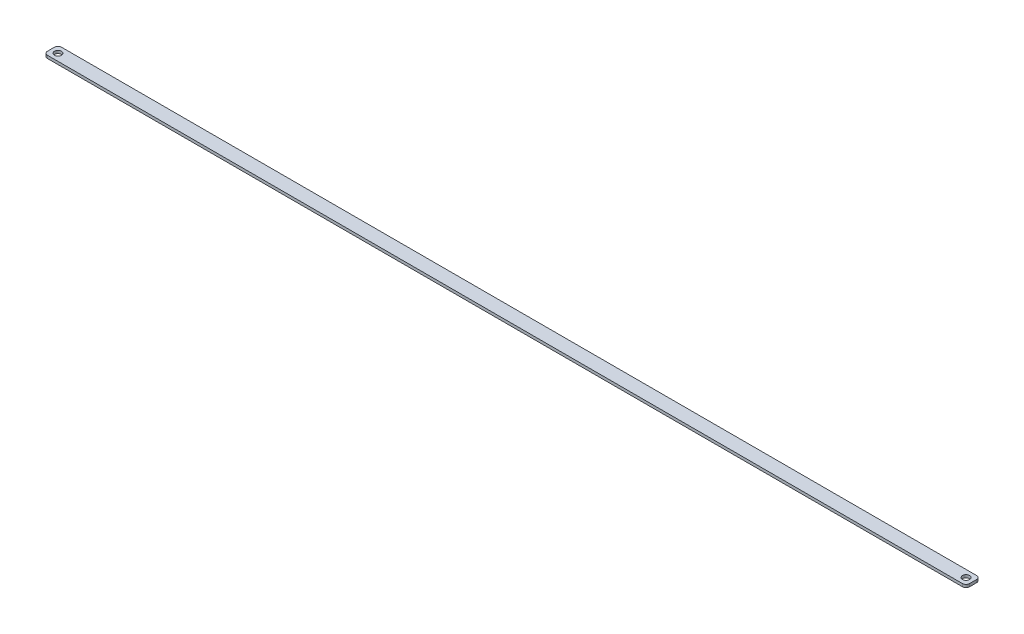
ISO-10303-21;
HEADER;
FILE_DESCRIPTION(('STEP AP214'),'2;1');
FILE_NAME('part.step','',(''),(''),'','','');
FILE_SCHEMA(('AUTOMOTIVE_DESIGN { 1 0 10303 214 1 1 1 1 }'));
ENDSEC;
DATA;
#1=APPLICATION_CONTEXT('core data for automotive mechanical design processes');
#2=APPLICATION_PROTOCOL_DEFINITION('international standard','automotive_design',2000,#1);
#3=PRODUCT_CONTEXT('',#1,'mechanical');
#4=PRODUCT('Part','Part','',(#3));
#5=PRODUCT_RELATED_PRODUCT_CATEGORY('part','',(#4));
#6=PRODUCT_DEFINITION_FORMATION('','',#4);
#7=PRODUCT_DEFINITION_CONTEXT('part definition',#1,'design');
#8=PRODUCT_DEFINITION('design','',#6,#7);
#9=PRODUCT_DEFINITION_SHAPE('','',#8);
#10=(LENGTH_UNIT() NAMED_UNIT(*) SI_UNIT(.MILLI.,.METRE.));
#11=(NAMED_UNIT(*) PLANE_ANGLE_UNIT() SI_UNIT($,.RADIAN.));
#12=(NAMED_UNIT(*) SI_UNIT($,.STERADIAN.) SOLID_ANGLE_UNIT());
#13=UNCERTAINTY_MEASURE_WITH_UNIT(LENGTH_MEASURE(1.E-05),#10,'distance_accuracy_value','');
#14=(GEOMETRIC_REPRESENTATION_CONTEXT(3) GLOBAL_UNCERTAINTY_ASSIGNED_CONTEXT((#13)) GLOBAL_UNIT_ASSIGNED_CONTEXT((#10,
#11,#12)) REPRESENTATION_CONTEXT('',''));
#15=CARTESIAN_POINT('',(0.,0.,0.));
#16=DIRECTION('',(0.,0.,1.));
#17=DIRECTION('',(1.,0.,0.));
#18=AXIS2_PLACEMENT_3D('',#15,#16,#17);
#19=CARTESIAN_POINT('',(355.829460253819,2.,-5.));
#20=DIRECTION('',(0.,-1.,0.));
#21=DIRECTION('',(0.,0.,-1.));
#22=AXIS2_PLACEMENT_3D('',#19,#20,#21);
#23=CYLINDRICAL_SURFACE('',#22,2.5);
#24=CARTESIAN_POINT('',(355.829460253819,0.,-5.));
#25=DIRECTION('',(0.,1.,0.));
#26=DIRECTION('',(0.,0.,1.));
#27=AXIS2_PLACEMENT_3D('',#24,#25,#26);
#28=CIRCLE('',#27,2.5);
#29=CARTESIAN_POINT('',(355.829460253819,0.,-2.5));
#30=VERTEX_POINT('',#29);
#31=EDGE_CURVE('E220',#30,#30,#28,.T.);
#32=ORIENTED_EDGE('',*,*,#31,.F.);
#33=EDGE_LOOP('',(#32));
#34=FACE_BOUND('',#33,.T.);
#35=CARTESIAN_POINT('',(355.829460253819,2.,-5.));
#36=DIRECTION('',(0.,1.,0.));
#37=DIRECTION('',(0.,0.,1.));
#38=AXIS2_PLACEMENT_3D('',#35,#36,#37);
#39=CIRCLE('',#38,2.5);
#40=CARTESIAN_POINT('',(355.829460253819,2.,-2.5));
#41=VERTEX_POINT('',#40);
#42=EDGE_CURVE('E13',#41,#41,#39,.T.);
#43=ORIENTED_EDGE('',*,*,#42,.T.);
#44=EDGE_LOOP('',(#43));
#45=FACE_BOUND('',#44,.T.);
#46=ADVANCED_FACE('F93',(#34,#45),#23,.F.);
#47=CARTESIAN_POINT('',(-291.170539746181,2.,-5.));
#48=DIRECTION('',(0.,-1.,0.));
#49=DIRECTION('',(0.,0.,-1.));
#50=AXIS2_PLACEMENT_3D('',#47,#48,#49);
#51=CYLINDRICAL_SURFACE('',#50,2.5);
#52=CARTESIAN_POINT('',(-291.170539746181,0.,-5.));
#53=DIRECTION('',(0.,1.,0.));
#54=DIRECTION('',(0.,0.,1.));
#55=AXIS2_PLACEMENT_3D('',#52,#53,#54);
#56=CIRCLE('',#55,2.5);
#57=CARTESIAN_POINT('',(-291.170539746181,0.,-2.5));
#58=VERTEX_POINT('',#57);
#59=EDGE_CURVE('E233',#58,#58,#56,.T.);
#60=ORIENTED_EDGE('',*,*,#59,.F.);
#61=EDGE_LOOP('',(#60));
#62=FACE_BOUND('',#61,.T.);
#63=CARTESIAN_POINT('',(-291.170539746181,2.,-5.));
#64=DIRECTION('',(0.,1.,0.));
#65=DIRECTION('',(0.,0.,1.));
#66=AXIS2_PLACEMENT_3D('',#63,#64,#65);
#67=CIRCLE('',#66,2.5);
#68=CARTESIAN_POINT('',(-291.170539746181,2.,-2.5));
#69=VERTEX_POINT('',#68);
#70=EDGE_CURVE('E103',#69,#69,#67,.T.);
#71=ORIENTED_EDGE('',*,*,#70,.T.);
#72=EDGE_LOOP('',(#71));
#73=FACE_BOUND('',#72,.T.);
#74=ADVANCED_FACE('F254',(#62,#73),#51,.F.);
#75=CARTESIAN_POINT('',(47.5,2.,-2.5));
#76=DIRECTION('',(0.,1.,0.));
#77=DIRECTION('',(0.,0.,1.));
#78=AXIS2_PLACEMENT_3D('',#75,#76,#77);
#79=PLANE('',#78);
#80=DIRECTION('',(1.,0.,0.));
#81=VECTOR('',#80,1.);
#82=CARTESIAN_POINT('',(-293.670539746181,2.,0.));
#83=LINE('',#82,#81);
#84=CARTESIAN_POINT('',(-293.670539746181,2.,0.));
#85=VERTEX_POINT('',#84);
#86=CARTESIAN_POINT('',(358.329460253819,2.,0.));
#87=VERTEX_POINT('',#86);
#88=EDGE_CURVE('E156',#85,#87,#83,.T.);
#89=ORIENTED_EDGE('',*,*,#88,.T.);
#90=CARTESIAN_POINT('',(358.329460253819,2.,-2.5));
#91=DIRECTION('',(0.,1.,0.));
#92=DIRECTION('',(0.,0.,1.));
#93=AXIS2_PLACEMENT_3D('',#90,#91,#92);
#94=CIRCLE('',#93,2.5);
#95=CARTESIAN_POINT('',(360.829460253819,2.,-2.50000000000002));
#96=VERTEX_POINT('',#95);
#97=EDGE_CURVE('E162',#87,#96,#94,.T.);
#98=ORIENTED_EDGE('',*,*,#97,.T.);
#99=DIRECTION('',(0.,0.,-1.));
#100=VECTOR('',#99,1.);
#101=CARTESIAN_POINT('',(360.829460253819,2.,-2.50000000000002));
#102=LINE('',#101,#100);
#103=CARTESIAN_POINT('',(360.829460253819,2.,-7.49999999999998));
#104=VERTEX_POINT('',#103);
#105=EDGE_CURVE('E184',#96,#104,#102,.T.);
#106=ORIENTED_EDGE('',*,*,#105,.T.);
#107=CARTESIAN_POINT('',(358.329460253819,2.,-7.5));
#108=DIRECTION('',(0.,1.,0.));
#109=DIRECTION('',(0.,0.,-1.));
#110=AXIS2_PLACEMENT_3D('',#107,#108,#109);
#111=CIRCLE('',#110,2.5);
#112=CARTESIAN_POINT('',(358.329460253819,2.,-10.));
#113=VERTEX_POINT('',#112);
#114=EDGE_CURVE('E188',#104,#113,#111,.T.);
#115=ORIENTED_EDGE('',*,*,#114,.T.);
#116=DIRECTION('',(-1.,0.,0.));
#117=VECTOR('',#116,1.);
#118=CARTESIAN_POINT('',(313.329460253819,2.,-10.));
#119=LINE('',#118,#117);
#120=CARTESIAN_POINT('',(-293.670539746181,2.,-10.));
#121=VERTEX_POINT('',#120);
#122=EDGE_CURVE('E242',#113,#121,#119,.T.);
#123=ORIENTED_EDGE('',*,*,#122,.T.);
#124=CARTESIAN_POINT('',(-293.670539746181,2.,-7.5));
#125=DIRECTION('',(0.,1.,0.));
#126=DIRECTION('',(0.,0.,-1.));
#127=AXIS2_PLACEMENT_3D('',#124,#125,#126);
#128=CIRCLE('',#127,2.5);
#129=CARTESIAN_POINT('',(-296.170539746181,2.,-7.49999999999998));
#130=VERTEX_POINT('',#129);
#131=EDGE_CURVE('E168',#121,#130,#128,.T.);
#132=ORIENTED_EDGE('',*,*,#131,.T.);
#133=DIRECTION('',(0.,0.,1.));
#134=VECTOR('',#133,1.);
#135=CARTESIAN_POINT('',(-296.170539746181,2.,-2.50000000000002));
#136=LINE('',#135,#134);
#137=CARTESIAN_POINT('',(-296.170539746181,2.,-2.50000000000002));
#138=VERTEX_POINT('',#137);
#139=EDGE_CURVE('E186',#130,#138,#136,.T.);
#140=ORIENTED_EDGE('',*,*,#139,.T.);
#141=CARTESIAN_POINT('',(-293.670539746181,2.,-2.5));
#142=DIRECTION('',(0.,1.,0.));
#143=DIRECTION('',(0.,0.,-1.));
#144=AXIS2_PLACEMENT_3D('',#141,#142,#143);
#145=CIRCLE('',#144,2.5);
#146=EDGE_CURVE('E165',#138,#85,#145,.T.);
#147=ORIENTED_EDGE('',*,*,#146,.T.);
#148=EDGE_LOOP('',(#89,#98,#106,#115,#123,#132,#140,#147));
#149=FACE_BOUND('',#148,.T.);
#150=ORIENTED_EDGE('',*,*,#42,.F.);
#151=EDGE_LOOP('',(#150));
#152=FACE_BOUND('',#151,.T.);
#153=ORIENTED_EDGE('',*,*,#70,.F.);
#154=EDGE_LOOP('',(#153));
#155=FACE_BOUND('',#154,.T.);
#156=ADVANCED_FACE('F158',(#149,#152,#155),#79,.T.);
#157=CARTESIAN_POINT('',(358.329460253819,0.,-2.5));
#158=DIRECTION('',(0.,1.,0.));
#159=DIRECTION('',(0.,0.,1.));
#160=AXIS2_PLACEMENT_3D('',#157,#158,#159);
#161=PLANE('',#160);
#162=ORIENTED_EDGE('',*,*,#31,.T.);
#163=EDGE_LOOP('',(#162));
#164=FACE_BOUND('',#163,.T.);
#165=CARTESIAN_POINT('',(358.329460253819,0.,-2.5));
#166=DIRECTION('',(0.,1.,0.));
#167=DIRECTION('',(0.,0.,1.));
#168=AXIS2_PLACEMENT_3D('',#165,#166,#167);
#169=CIRCLE('',#168,2.5);
#170=CARTESIAN_POINT('',(358.329460253819,0.,0.));
#171=VERTEX_POINT('',#170);
#172=CARTESIAN_POINT('',(360.829460253819,0.,-2.50000000000002));
#173=VERTEX_POINT('',#172);
#174=EDGE_CURVE('E177',#171,#173,#169,.T.);
#175=ORIENTED_EDGE('',*,*,#174,.F.);
#176=DIRECTION('',(1.,0.,0.));
#177=VECTOR('',#176,1.);
#178=CARTESIAN_POINT('',(-293.670539746181,0.,0.));
#179=LINE('',#178,#177);
#180=CARTESIAN_POINT('',(-293.670539746181,0.,0.));
#181=VERTEX_POINT('',#180);
#182=EDGE_CURVE('E173',#181,#171,#179,.T.);
#183=ORIENTED_EDGE('',*,*,#182,.F.);
#184=CARTESIAN_POINT('',(-293.670539746181,0.,-2.5));
#185=DIRECTION('',(0.,1.,0.));
#186=DIRECTION('',(0.,0.,-1.));
#187=AXIS2_PLACEMENT_3D('',#184,#185,#186);
#188=CIRCLE('',#187,2.5);
#189=CARTESIAN_POINT('',(-296.170539746181,0.,-2.50000000000002));
#190=VERTEX_POINT('',#189);
#191=EDGE_CURVE('E199',#190,#181,#188,.T.);
#192=ORIENTED_EDGE('',*,*,#191,.F.);
#193=DIRECTION('',(0.,0.,1.));
#194=VECTOR('',#193,1.);
#195=CARTESIAN_POINT('',(-296.170539746181,0.,-2.50000000000002));
#196=LINE('',#195,#194);
#197=CARTESIAN_POINT('',(-296.170539746181,0.,-7.49999999999998));
#198=VERTEX_POINT('',#197);
#199=EDGE_CURVE('E206',#198,#190,#196,.T.);
#200=ORIENTED_EDGE('',*,*,#199,.F.);
#201=CARTESIAN_POINT('',(-293.670539746181,0.,-7.5));
#202=DIRECTION('',(0.,1.,0.));
#203=DIRECTION('',(0.,0.,-1.));
#204=AXIS2_PLACEMENT_3D('',#201,#202,#203);
#205=CIRCLE('',#204,2.5);
#206=CARTESIAN_POINT('',(-293.670539746181,0.,-10.));
#207=VERTEX_POINT('',#206);
#208=EDGE_CURVE('E212',#207,#198,#205,.T.);
#209=ORIENTED_EDGE('',*,*,#208,.F.);
#210=DIRECTION('',(-1.,0.,0.));
#211=VECTOR('',#210,1.);
#212=CARTESIAN_POINT('',(313.329460253819,0.,-10.));
#213=LINE('',#212,#211);
#214=CARTESIAN_POINT('',(358.329460253819,0.,-10.));
#215=VERTEX_POINT('',#214);
#216=EDGE_CURVE('E218',#215,#207,#213,.T.);
#217=ORIENTED_EDGE('',*,*,#216,.F.);
#218=CARTESIAN_POINT('',(358.329460253819,0.,-7.5));
#219=DIRECTION('',(0.,1.,0.));
#220=DIRECTION('',(0.,0.,-1.));
#221=AXIS2_PLACEMENT_3D('',#218,#219,#220);
#222=CIRCLE('',#221,2.5);
#223=CARTESIAN_POINT('',(360.829460253819,0.,-7.49999999999998));
#224=VERTEX_POINT('',#223);
#225=EDGE_CURVE('E223',#224,#215,#222,.T.);
#226=ORIENTED_EDGE('',*,*,#225,.F.);
#227=DIRECTION('',(0.,0.,-1.));
#228=VECTOR('',#227,1.);
#229=CARTESIAN_POINT('',(360.829460253819,0.,-2.50000000000002));
#230=LINE('',#229,#228);
#231=EDGE_CURVE('E178',#173,#224,#230,.T.);
#232=ORIENTED_EDGE('',*,*,#231,.F.);
#233=EDGE_LOOP('',(#175,#183,#192,#200,#209,#217,#226,#232));
#234=FACE_BOUND('',#233,.T.);
#235=ORIENTED_EDGE('',*,*,#59,.T.);
#236=EDGE_LOOP('',(#235));
#237=FACE_BOUND('',#236,.T.);
#238=ADVANCED_FACE('F249',(#164,#234,#237),#161,.F.);
#239=CARTESIAN_POINT('',(313.329460253819,2.,-10.));
#240=DIRECTION('',(0.,0.,1.));
#241=DIRECTION('',(1.,0.,0.));
#242=AXIS2_PLACEMENT_3D('',#239,#240,#241);
#243=PLANE('',#242);
#244=ORIENTED_EDGE('',*,*,#216,.T.);
#245=DIRECTION('',(0.,-1.,0.));
#246=VECTOR('',#245,1.);
#247=CARTESIAN_POINT('',(-293.670539746181,2.,-10.));
#248=LINE('',#247,#246);
#249=EDGE_CURVE('E209',#121,#207,#248,.T.);
#250=ORIENTED_EDGE('',*,*,#249,.F.);
#251=ORIENTED_EDGE('',*,*,#122,.F.);
#252=DIRECTION('',(0.,-1.,0.));
#253=VECTOR('',#252,1.);
#254=CARTESIAN_POINT('',(358.329460253819,2.,-10.));
#255=LINE('',#254,#253);
#256=EDGE_CURVE('E112',#113,#215,#255,.T.);
#257=ORIENTED_EDGE('',*,*,#256,.T.);
#258=EDGE_LOOP('',(#244,#250,#251,#257));
#259=FACE_BOUND('',#258,.T.);
#260=ADVANCED_FACE('F271',(#259),#243,.F.);
#261=CARTESIAN_POINT('',(313.329460253819,2.,0.));
#262=DIRECTION('',(0.,0.,-1.));
#263=DIRECTION('',(-1.,0.,0.));
#264=AXIS2_PLACEMENT_3D('',#261,#262,#263);
#265=PLANE('',#264);
#266=DIRECTION('',(0.,-1.,0.));
#267=VECTOR('',#266,1.);
#268=CARTESIAN_POINT('',(358.329460253819,2.,0.));
#269=LINE('',#268,#267);
#270=EDGE_CURVE('E171',#87,#171,#269,.T.);
#271=ORIENTED_EDGE('',*,*,#270,.F.);
#272=ORIENTED_EDGE('',*,*,#88,.F.);
#273=DIRECTION('',(0.,-1.,0.));
#274=VECTOR('',#273,1.);
#275=CARTESIAN_POINT('',(-293.670539746181,2.,0.));
#276=LINE('',#275,#274);
#277=EDGE_CURVE('E196',#85,#181,#276,.T.);
#278=ORIENTED_EDGE('',*,*,#277,.T.);
#279=ORIENTED_EDGE('',*,*,#182,.T.);
#280=EDGE_LOOP('',(#271,#272,#278,#279));
#281=FACE_BOUND('',#280,.T.);
#282=ADVANCED_FACE('F172',(#281),#265,.F.);
#283=CARTESIAN_POINT('',(358.329460253819,2.,-2.5));
#284=DIRECTION('',(0.,-1.,0.));
#285=DIRECTION('',(0.,0.,-1.));
#286=AXIS2_PLACEMENT_3D('',#283,#284,#285);
#287=CYLINDRICAL_SURFACE('',#286,2.5);
#288=ORIENTED_EDGE('',*,*,#174,.T.);
#289=DIRECTION('',(0.,-1.,0.));
#290=VECTOR('',#289,1.);
#291=CARTESIAN_POINT('',(360.829460253819,2.,-2.50000000000002));
#292=LINE('',#291,#290);
#293=EDGE_CURVE('E182',#96,#173,#292,.T.);
#294=ORIENTED_EDGE('',*,*,#293,.F.);
#295=ORIENTED_EDGE('',*,*,#97,.F.);
#296=ORIENTED_EDGE('',*,*,#270,.T.);
#297=EDGE_LOOP('',(#288,#294,#295,#296));
#298=FACE_BOUND('',#297,.T.);
#299=ADVANCED_FACE('F180',(#298),#287,.T.);
#300=CARTESIAN_POINT('',(360.829460253819,2.,-2.50000000000002));
#301=DIRECTION('',(-1.,0.,0.));
#302=DIRECTION('',(0.,0.,1.));
#303=AXIS2_PLACEMENT_3D('',#300,#301,#302);
#304=PLANE('',#303);
#305=ORIENTED_EDGE('',*,*,#231,.T.);
#306=DIRECTION('',(0.,-1.,0.));
#307=VECTOR('',#306,1.);
#308=CARTESIAN_POINT('',(360.829460253819,2.,-7.49999999999998));
#309=LINE('',#308,#307);
#310=EDGE_CURVE('E215',#104,#224,#309,.T.);
#311=ORIENTED_EDGE('',*,*,#310,.F.);
#312=ORIENTED_EDGE('',*,*,#105,.F.);
#313=ORIENTED_EDGE('',*,*,#293,.T.);
#314=EDGE_LOOP('',(#305,#311,#312,#313));
#315=FACE_BOUND('',#314,.T.);
#316=ADVANCED_FACE('F278',(#315),#304,.F.);
#317=CARTESIAN_POINT('',(358.329460253819,2.,-7.5));
#318=DIRECTION('',(0.,-1.,0.));
#319=DIRECTION('',(0.,0.,-1.));
#320=AXIS2_PLACEMENT_3D('',#317,#318,#319);
#321=CYLINDRICAL_SURFACE('',#320,2.5);
#322=ORIENTED_EDGE('',*,*,#225,.T.);
#323=ORIENTED_EDGE('',*,*,#256,.F.);
#324=ORIENTED_EDGE('',*,*,#114,.F.);
#325=ORIENTED_EDGE('',*,*,#310,.T.);
#326=EDGE_LOOP('',(#322,#323,#324,#325));
#327=FACE_BOUND('',#326,.T.);
#328=ADVANCED_FACE('F281',(#327),#321,.T.);
#329=CARTESIAN_POINT('',(-293.670539746181,2.,-7.5));
#330=DIRECTION('',(0.,-1.,0.));
#331=DIRECTION('',(0.,0.,-1.));
#332=AXIS2_PLACEMENT_3D('',#329,#330,#331);
#333=CYLINDRICAL_SURFACE('',#332,2.5);
#334=ORIENTED_EDGE('',*,*,#208,.T.);
#335=DIRECTION('',(0.,-1.,0.));
#336=VECTOR('',#335,1.);
#337=CARTESIAN_POINT('',(-296.170539746181,2.,-7.49999999999998));
#338=LINE('',#337,#336);
#339=EDGE_CURVE('E202',#130,#198,#338,.T.);
#340=ORIENTED_EDGE('',*,*,#339,.F.);
#341=ORIENTED_EDGE('',*,*,#131,.F.);
#342=ORIENTED_EDGE('',*,*,#249,.T.);
#343=EDGE_LOOP('',(#334,#340,#341,#342));
#344=FACE_BOUND('',#343,.T.);
#345=ADVANCED_FACE('F285',(#344),#333,.T.);
#346=CARTESIAN_POINT('',(-296.170539746181,2.,-2.50000000000002));
#347=DIRECTION('',(1.,0.,0.));
#348=DIRECTION('',(0.,0.,-1.));
#349=AXIS2_PLACEMENT_3D('',#346,#347,#348);
#350=PLANE('',#349);
#351=ORIENTED_EDGE('',*,*,#199,.T.);
#352=DIRECTION('',(0.,-1.,0.));
#353=VECTOR('',#352,1.);
#354=CARTESIAN_POINT('',(-296.170539746181,2.,-2.50000000000002));
#355=LINE('',#354,#353);
#356=EDGE_CURVE('E203',#138,#190,#355,.T.);
#357=ORIENTED_EDGE('',*,*,#356,.F.);
#358=ORIENTED_EDGE('',*,*,#139,.F.);
#359=ORIENTED_EDGE('',*,*,#339,.T.);
#360=EDGE_LOOP('',(#351,#357,#358,#359));
#361=FACE_BOUND('',#360,.T.);
#362=ADVANCED_FACE('F288',(#361),#350,.F.);
#363=CARTESIAN_POINT('',(-293.670539746181,2.,-2.5));
#364=DIRECTION('',(0.,-1.,0.));
#365=DIRECTION('',(0.,0.,-1.));
#366=AXIS2_PLACEMENT_3D('',#363,#364,#365);
#367=CYLINDRICAL_SURFACE('',#366,2.5);
#368=ORIENTED_EDGE('',*,*,#191,.T.);
#369=ORIENTED_EDGE('',*,*,#277,.F.);
#370=ORIENTED_EDGE('',*,*,#146,.F.);
#371=ORIENTED_EDGE('',*,*,#356,.T.);
#372=EDGE_LOOP('',(#368,#369,#370,#371));
#373=FACE_BOUND('',#372,.T.);
#374=ADVANCED_FACE('F95',(#373),#367,.T.);
#375=CLOSED_SHELL('',(#46,#74,#156,#238,#260,#282,#299,#316,#328,#345,#362,#374));
#376=MANIFOLD_SOLID_BREP('B2',#375);
#377=ADVANCED_BREP_SHAPE_REPRESENTATION('',(#18,#376),#14);
#378=SHAPE_DEFINITION_REPRESENTATION(#9,#377);
ENDSEC;
END-ISO-10303-21;
